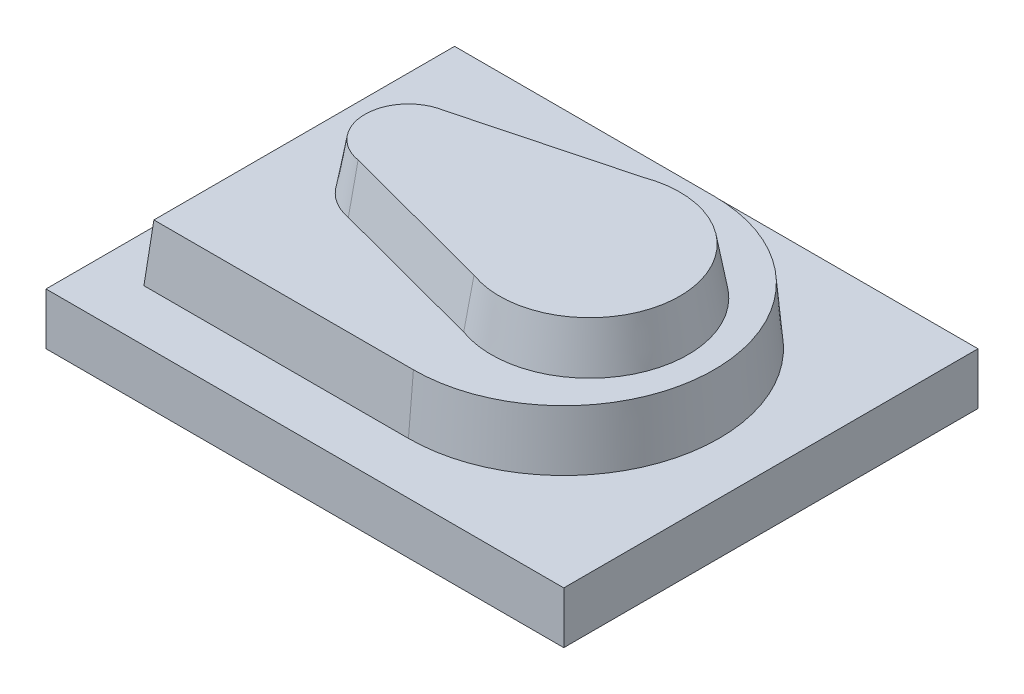
ISO-10303-21;
HEADER;
FILE_DESCRIPTION(('STEP AP214'),'2;1');
FILE_NAME('part.step','',(''),(''),'','','');
FILE_SCHEMA(('AUTOMOTIVE_DESIGN { 1 0 10303 214 1 1 1 1 }'));
ENDSEC;
DATA;
#1=APPLICATION_CONTEXT('core data for automotive mechanical design processes');
#2=APPLICATION_PROTOCOL_DEFINITION('international standard','automotive_design',2000,#1);
#3=PRODUCT_CONTEXT('',#1,'mechanical');
#4=PRODUCT('Part','Part','',(#3));
#5=PRODUCT_RELATED_PRODUCT_CATEGORY('part','',(#4));
#6=PRODUCT_DEFINITION_FORMATION('','',#4);
#7=PRODUCT_DEFINITION_CONTEXT('part definition',#1,'design');
#8=PRODUCT_DEFINITION('design','',#6,#7);
#9=PRODUCT_DEFINITION_SHAPE('','',#8);
#10=(LENGTH_UNIT() NAMED_UNIT(*) SI_UNIT(.MILLI.,.METRE.));
#11=(NAMED_UNIT(*) PLANE_ANGLE_UNIT() SI_UNIT($,.RADIAN.));
#12=(NAMED_UNIT(*) SI_UNIT($,.STERADIAN.) SOLID_ANGLE_UNIT());
#13=UNCERTAINTY_MEASURE_WITH_UNIT(LENGTH_MEASURE(1.E-05),#10,'distance_accuracy_value','');
#14=(GEOMETRIC_REPRESENTATION_CONTEXT(3) GLOBAL_UNCERTAINTY_ASSIGNED_CONTEXT((#13)) GLOBAL_UNIT_ASSIGNED_CONTEXT((#10,
#11,#12)) REPRESENTATION_CONTEXT('',''));
#15=CARTESIAN_POINT('',(0.,0.,0.));
#16=DIRECTION('',(0.,0.,1.));
#17=DIRECTION('',(1.,0.,0.));
#18=AXIS2_PLACEMENT_3D('',#15,#16,#17);
#19=CARTESIAN_POINT('',(50.,10.,-40.));
#20=DIRECTION('',(-1.,0.,0.));
#21=DIRECTION('',(0.,0.,1.));
#22=AXIS2_PLACEMENT_3D('',#19,#20,#21);
#23=PLANE('',#22);
#24=DIRECTION('',(0.,0.,-1.));
#25=VECTOR('',#24,1.);
#26=CARTESIAN_POINT('',(50.,0.,-40.));
#27=LINE('',#26,#25);
#28=CARTESIAN_POINT('',(50.,0.,40.));
#29=VERTEX_POINT('',#28);
#30=CARTESIAN_POINT('',(50.,0.,-40.));
#31=VERTEX_POINT('',#30);
#32=EDGE_CURVE('E210',#29,#31,#27,.T.);
#33=ORIENTED_EDGE('',*,*,#32,.T.);
#34=DIRECTION('',(0.,-1.,0.));
#35=VECTOR('',#34,1.);
#36=CARTESIAN_POINT('',(50.,10.,-40.));
#37=LINE('',#36,#35);
#38=CARTESIAN_POINT('',(50.,10.,-40.));
#39=VERTEX_POINT('',#38);
#40=EDGE_CURVE('E11',#39,#31,#37,.T.);
#41=ORIENTED_EDGE('',*,*,#40,.F.);
#42=DIRECTION('',(0.,0.,-1.));
#43=VECTOR('',#42,1.);
#44=CARTESIAN_POINT('',(50.,10.,-40.));
#45=LINE('',#44,#43);
#46=CARTESIAN_POINT('',(50.,10.,40.));
#47=VERTEX_POINT('',#46);
#48=EDGE_CURVE('E228',#47,#39,#45,.T.);
#49=ORIENTED_EDGE('',*,*,#48,.F.);
#50=DIRECTION('',(0.,-1.,0.));
#51=VECTOR('',#50,1.);
#52=CARTESIAN_POINT('',(50.,10.,40.));
#53=LINE('',#52,#51);
#54=EDGE_CURVE('E238',#47,#29,#53,.T.);
#55=ORIENTED_EDGE('',*,*,#54,.T.);
#56=EDGE_LOOP('',(#33,#41,#49,#55));
#57=FACE_BOUND('',#56,.T.);
#58=ADVANCED_FACE('F37',(#57),#23,.F.);
#59=CARTESIAN_POINT('',(-50.,10.,-40.));
#60=DIRECTION('',(0.,0.,1.));
#61=DIRECTION('',(1.,0.,0.));
#62=AXIS2_PLACEMENT_3D('',#59,#60,#61);
#63=PLANE('',#62);
#64=DIRECTION('',(-1.,0.,0.));
#65=VECTOR('',#64,1.);
#66=CARTESIAN_POINT('',(-50.,0.,-40.));
#67=LINE('',#66,#65);
#68=CARTESIAN_POINT('',(-50.,0.,-40.));
#69=VERTEX_POINT('',#68);
#70=EDGE_CURVE('E241',#31,#69,#67,.T.);
#71=ORIENTED_EDGE('',*,*,#70,.T.);
#72=DIRECTION('',(0.,-1.,0.));
#73=VECTOR('',#72,1.);
#74=CARTESIAN_POINT('',(-50.,10.,-40.));
#75=LINE('',#74,#73);
#76=CARTESIAN_POINT('',(-50.,10.,-40.));
#77=VERTEX_POINT('',#76);
#78=EDGE_CURVE('E44',#77,#69,#75,.T.);
#79=ORIENTED_EDGE('',*,*,#78,.F.);
#80=DIRECTION('',(-1.,0.,0.));
#81=VECTOR('',#80,1.);
#82=CARTESIAN_POINT('',(-50.,10.,-40.));
#83=LINE('',#82,#81);
#84=EDGE_CURVE('E231',#39,#77,#83,.T.);
#85=ORIENTED_EDGE('',*,*,#84,.F.);
#86=ORIENTED_EDGE('',*,*,#40,.T.);
#87=EDGE_LOOP('',(#71,#79,#85,#86));
#88=FACE_BOUND('',#87,.T.);
#89=ADVANCED_FACE('F271',(#88),#63,.F.);
#90=CARTESIAN_POINT('',(-50.,10.,-40.));
#91=DIRECTION('',(1.,0.,0.));
#92=DIRECTION('',(0.,0.,-1.));
#93=AXIS2_PLACEMENT_3D('',#90,#91,#92);
#94=PLANE('',#93);
#95=DIRECTION('',(0.,0.,1.));
#96=VECTOR('',#95,1.);
#97=CARTESIAN_POINT('',(-50.,0.,-40.));
#98=LINE('',#97,#96);
#99=CARTESIAN_POINT('',(-50.,0.,40.));
#100=VERTEX_POINT('',#99);
#101=EDGE_CURVE('E243',#69,#100,#98,.T.);
#102=ORIENTED_EDGE('',*,*,#101,.T.);
#103=DIRECTION('',(0.,-1.,0.));
#104=VECTOR('',#103,1.);
#105=CARTESIAN_POINT('',(-50.,10.,40.));
#106=LINE('',#105,#104);
#107=CARTESIAN_POINT('',(-50.,10.,40.));
#108=VERTEX_POINT('',#107);
#109=EDGE_CURVE('E248',#108,#100,#106,.T.);
#110=ORIENTED_EDGE('',*,*,#109,.F.);
#111=DIRECTION('',(0.,0.,1.));
#112=VECTOR('',#111,1.);
#113=CARTESIAN_POINT('',(-50.,10.,-40.));
#114=LINE('',#113,#112);
#115=EDGE_CURVE('E234',#77,#108,#114,.T.);
#116=ORIENTED_EDGE('',*,*,#115,.F.);
#117=ORIENTED_EDGE('',*,*,#78,.T.);
#118=EDGE_LOOP('',(#102,#110,#116,#117));
#119=FACE_BOUND('',#118,.T.);
#120=ADVANCED_FACE('F255',(#119),#94,.F.);
#121=CARTESIAN_POINT('',(-50.,10.,40.));
#122=DIRECTION('',(0.,0.,-1.));
#123=DIRECTION('',(-1.,0.,0.));
#124=AXIS2_PLACEMENT_3D('',#121,#122,#123);
#125=PLANE('',#124);
#126=DIRECTION('',(1.,0.,0.));
#127=VECTOR('',#126,1.);
#128=CARTESIAN_POINT('',(-50.,0.,40.));
#129=LINE('',#128,#127);
#130=EDGE_CURVE('E232',#100,#29,#129,.T.);
#131=ORIENTED_EDGE('',*,*,#130,.T.);
#132=ORIENTED_EDGE('',*,*,#54,.F.);
#133=DIRECTION('',(1.,0.,0.));
#134=VECTOR('',#133,1.);
#135=CARTESIAN_POINT('',(-50.,10.,40.));
#136=LINE('',#135,#134);
#137=EDGE_CURVE('E236',#108,#47,#136,.T.);
#138=ORIENTED_EDGE('',*,*,#137,.F.);
#139=ORIENTED_EDGE('',*,*,#109,.T.);
#140=EDGE_LOOP('',(#131,#132,#138,#139));
#141=FACE_BOUND('',#140,.T.);
#142=ADVANCED_FACE('F264',(#141),#125,.F.);
#143=CARTESIAN_POINT('',(0.,10.,0.));
#144=DIRECTION('',(0.,1.,0.));
#145=DIRECTION('',(0.,0.,1.));
#146=AXIS2_PLACEMENT_3D('',#143,#144,#145);
#147=PLANE('',#146);
#148=CARTESIAN_POINT('',(10.,10.,0.));
#149=DIRECTION('',(0.,1.,0.));
#150=DIRECTION('',(0.,0.,-1.));
#151=AXIS2_PLACEMENT_3D('',#148,#149,#150);
#152=CIRCLE('',#151,30.);
#153=CARTESIAN_POINT('',(10.,10.,30.));
#154=VERTEX_POINT('',#153);
#155=CARTESIAN_POINT('',(10.,10.,-30.));
#156=VERTEX_POINT('',#155);
#157=EDGE_CURVE('E157',#154,#156,#152,.T.);
#158=ORIENTED_EDGE('',*,*,#157,.F.);
#159=DIRECTION('',(1.,0.,0.));
#160=VECTOR('',#159,1.);
#161=CARTESIAN_POINT('',(-41.0897911259424,10.,30.));
#162=LINE('',#161,#160);
#163=CARTESIAN_POINT('',(-41.0897911259424,10.,30.));
#164=VERTEX_POINT('',#163);
#165=EDGE_CURVE('E203',#164,#154,#162,.T.);
#166=ORIENTED_EDGE('',*,*,#165,.F.);
#167=DIRECTION('',(0.,0.,1.));
#168=VECTOR('',#167,1.);
#169=CARTESIAN_POINT('',(-41.0897911259424,10.,-30.));
#170=LINE('',#169,#168);
#171=CARTESIAN_POINT('',(-41.0897911259424,10.,-30.));
#172=VERTEX_POINT('',#171);
#173=EDGE_CURVE('E200',#172,#164,#170,.T.);
#174=ORIENTED_EDGE('',*,*,#173,.F.);
#175=DIRECTION('',(-1.,0.,0.));
#176=VECTOR('',#175,1.);
#177=CARTESIAN_POINT('',(10.,10.,-30.));
#178=LINE('',#177,#176);
#179=EDGE_CURVE('E197',#156,#172,#178,.T.);
#180=ORIENTED_EDGE('',*,*,#179,.F.);
#181=EDGE_LOOP('',(#158,#166,#174,#180));
#182=FACE_BOUND('',#181,.T.);
#183=ORIENTED_EDGE('',*,*,#48,.T.);
#184=ORIENTED_EDGE('',*,*,#84,.T.);
#185=ORIENTED_EDGE('',*,*,#115,.T.);
#186=ORIENTED_EDGE('',*,*,#137,.T.);
#187=EDGE_LOOP('',(#183,#184,#185,#186));
#188=FACE_BOUND('',#187,.T.);
#189=ADVANCED_FACE('F270',(#182,#188),#147,.T.);
#190=CARTESIAN_POINT('',(0.,0.,0.));
#191=DIRECTION('',(0.,1.,0.));
#192=DIRECTION('',(0.,0.,1.));
#193=AXIS2_PLACEMENT_3D('',#190,#191,#192);
#194=PLANE('',#193);
#195=ORIENTED_EDGE('',*,*,#32,.F.);
#196=ORIENTED_EDGE('',*,*,#130,.F.);
#197=ORIENTED_EDGE('',*,*,#101,.F.);
#198=ORIENTED_EDGE('',*,*,#70,.F.);
#199=EDGE_LOOP('',(#195,#196,#197,#198));
#200=FACE_BOUND('',#199,.T.);
#201=ADVANCED_FACE('F261',(#200),#194,.F.);
#202=CARTESIAN_POINT('',(10.,10.,0.));
#203=DIRECTION('',(0.,-1.,0.));
#204=DIRECTION('',(0.,0.,-1.));
#205=AXIS2_PLACEMENT_3D('',#202,#203,#204);
#206=CONICAL_SURFACE('',#205,30.,0.0872664625997167);
#207=ORIENTED_EDGE('',*,*,#157,.T.);
#208=DIRECTION('',(0.,-0.996194698091745,-0.0871557427476584));
#209=VECTOR('',#208,1.);
#210=CARTESIAN_POINT('',(10.,10.,-30.));
#211=LINE('',#210,#209);
#212=CARTESIAN_POINT('',(10.,21.,-29.0376247012148));
#213=VERTEX_POINT('',#212);
#214=EDGE_CURVE('E207',#213,#156,#211,.T.);
#215=ORIENTED_EDGE('',*,*,#214,.F.);
#216=CARTESIAN_POINT('',(10.,21.,0.));
#217=DIRECTION('',(0.,-1.,0.));
#218=DIRECTION('',(0.,0.,-1.));
#219=AXIS2_PLACEMENT_3D('',#216,#217,#218);
#220=CIRCLE('',#219,29.0376247012148);
#221=CARTESIAN_POINT('',(10.,21.,29.0376247012148));
#222=VERTEX_POINT('',#221);
#223=EDGE_CURVE('E206',#222,#213,#220,.F.);
#224=ORIENTED_EDGE('',*,*,#223,.F.);
#225=DIRECTION('',(0.,-0.996194698091745,0.0871557427476583));
#226=VECTOR('',#225,1.);
#227=CARTESIAN_POINT('',(10.,10.,30.));
#228=LINE('',#227,#226);
#229=EDGE_CURVE('E212',#222,#154,#228,.T.);
#230=ORIENTED_EDGE('',*,*,#229,.T.);
#231=EDGE_LOOP('',(#207,#215,#224,#230));
#232=FACE_BOUND('',#231,.T.);
#233=ADVANCED_FACE('F283',(#232),#206,.T.);
#234=CARTESIAN_POINT('',(10.,10.,-30.));
#235=DIRECTION('',(0.,0.0871557427476584,-0.996194698091746));
#236=DIRECTION('',(0.,0.996194698091746,0.0871557427476584));
#237=AXIS2_PLACEMENT_3D('',#234,#235,#236);
#238=PLANE('',#237);
#239=ORIENTED_EDGE('',*,*,#179,.T.);
#240=DIRECTION('',(-0.0868265938642478,-0.992432509138967,-0.0868265938642478));
#241=VECTOR('',#240,1.);
#242=CARTESIAN_POINT('',(-41.0897911259424,10.,-30.));
#243=LINE('',#242,#241);
#244=CARTESIAN_POINT('',(-40.1274158271572,21.,-29.0376247012148));
#245=VERTEX_POINT('',#244);
#246=EDGE_CURVE('E211',#245,#172,#243,.T.);
#247=ORIENTED_EDGE('',*,*,#246,.F.);
#248=DIRECTION('',(1.,0.,0.));
#249=VECTOR('',#248,1.);
#250=CARTESIAN_POINT('',(10.,21.,-29.0376247012148));
#251=LINE('',#250,#249);
#252=EDGE_CURVE('E223',#213,#245,#251,.F.);
#253=ORIENTED_EDGE('',*,*,#252,.F.);
#254=ORIENTED_EDGE('',*,*,#214,.T.);
#255=EDGE_LOOP('',(#239,#247,#253,#254));
#256=FACE_BOUND('',#255,.T.);
#257=ADVANCED_FACE('F287',(#256),#238,.T.);
#258=CARTESIAN_POINT('',(-41.0897911259424,10.,-30.));
#259=DIRECTION('',(-0.996194698091746,0.0871557427476584,0.));
#260=DIRECTION('',(-0.0871557427476584,-0.996194698091746,0.));
#261=AXIS2_PLACEMENT_3D('',#258,#259,#260);
#262=PLANE('',#261);
#263=ORIENTED_EDGE('',*,*,#173,.T.);
#264=DIRECTION('',(-0.0868265938642478,-0.992432509138967,0.0868265938642478));
#265=VECTOR('',#264,1.);
#266=CARTESIAN_POINT('',(-41.0897911259424,10.,30.));
#267=LINE('',#266,#265);
#268=CARTESIAN_POINT('',(-40.1274158271572,21.,29.0376247012148));
#269=VERTEX_POINT('',#268);
#270=EDGE_CURVE('E215',#269,#164,#267,.T.);
#271=ORIENTED_EDGE('',*,*,#270,.F.);
#272=DIRECTION('',(0.,0.,-1.));
#273=VECTOR('',#272,1.);
#274=CARTESIAN_POINT('',(-40.1274158271572,21.,0.));
#275=LINE('',#274,#273);
#276=EDGE_CURVE('E225',#245,#269,#275,.F.);
#277=ORIENTED_EDGE('',*,*,#276,.F.);
#278=ORIENTED_EDGE('',*,*,#246,.T.);
#279=EDGE_LOOP('',(#263,#271,#277,#278));
#280=FACE_BOUND('',#279,.T.);
#281=ADVANCED_FACE('F290',(#280),#262,.T.);
#282=CARTESIAN_POINT('',(-41.0897911259424,10.,30.));
#283=DIRECTION('',(0.,0.0871557427476584,0.996194698091745));
#284=DIRECTION('',(0.,-0.996194698091746,0.0871557427476584));
#285=AXIS2_PLACEMENT_3D('',#282,#283,#284);
#286=PLANE('',#285);
#287=ORIENTED_EDGE('',*,*,#165,.T.);
#288=ORIENTED_EDGE('',*,*,#229,.F.);
#289=DIRECTION('',(-1.,0.,0.));
#290=VECTOR('',#289,1.);
#291=CARTESIAN_POINT('',(10.,21.,29.0376247012148));
#292=LINE('',#291,#290);
#293=EDGE_CURVE('E216',#269,#222,#292,.F.);
#294=ORIENTED_EDGE('',*,*,#293,.F.);
#295=ORIENTED_EDGE('',*,*,#270,.T.);
#296=EDGE_LOOP('',(#287,#288,#294,#295));
#297=FACE_BOUND('',#296,.T.);
#298=ADVANCED_FACE('F294',(#297),#286,.T.);
#299=CARTESIAN_POINT('',(10.,21.,0.));
#300=DIRECTION('',(0.,-1.,0.));
#301=DIRECTION('',(0.,0.,-1.));
#302=AXIS2_PLACEMENT_3D('',#299,#300,#301);
#303=PLANE('',#302);
#304=DIRECTION('',(0.966679512896648,0.,0.255989686014689));
#305=VECTOR('',#304,1.);
#306=CARTESIAN_POINT('',(-21.7670121436894,21.,9.84264538038703));
#307=LINE('',#306,#305);
#308=CARTESIAN_POINT('',(-21.7670121436894,21.,9.84264538038703));
#309=VERTEX_POINT('',#308);
#310=CARTESIAN_POINT('',(8.54274170911381,21.,17.8690742727423));
#311=VERTEX_POINT('',#310);
#312=EDGE_CURVE('E127',#309,#311,#307,.T.);
#313=ORIENTED_EDGE('',*,*,#312,.F.);
#314=CARTESIAN_POINT('',(-20.,21.,0.));
#315=DIRECTION('',(0.,-1.,0.));
#316=DIRECTION('',(0.,0.,-1.));
#317=AXIS2_PLACEMENT_3D('',#314,#315,#316);
#318=CIRCLE('',#317,10.);
#319=CARTESIAN_POINT('',(-21.7647349909528,21.,-9.84305391693588));
#320=VERTEX_POINT('',#319);
#321=EDGE_CURVE('E51',#309,#320,#318,.T.);
#322=ORIENTED_EDGE('',*,*,#321,.T.);
#323=DIRECTION('',(0.966695617723164,0.,-0.255928862527911));
#324=VECTOR('',#323,1.);
#325=CARTESIAN_POINT('',(-21.7647349909528,21.,-9.84305391693588));
#326=LINE('',#325,#324);
#327=CARTESIAN_POINT('',(8.51978118974144,21.,-17.860760458927));
#328=VERTEX_POINT('',#327);
#329=EDGE_CURVE('E56',#320,#328,#326,.T.);
#330=ORIENTED_EDGE('',*,*,#329,.T.);
#331=CARTESIAN_POINT('',(15.,21.,0.));
#332=DIRECTION('',(0.,-1.,0.));
#333=DIRECTION('',(0.,0.,-1.));
#334=AXIS2_PLACEMENT_3D('',#331,#332,#333);
#335=CIRCLE('',#334,19.);
#336=EDGE_CURVE('E122',#328,#311,#335,.T.);
#337=ORIENTED_EDGE('',*,*,#336,.T.);
#338=EDGE_LOOP('',(#313,#322,#330,#337));
#339=FACE_BOUND('',#338,.T.);
#340=ORIENTED_EDGE('',*,*,#223,.T.);
#341=ORIENTED_EDGE('',*,*,#252,.T.);
#342=ORIENTED_EDGE('',*,*,#276,.T.);
#343=ORIENTED_EDGE('',*,*,#293,.T.);
#344=EDGE_LOOP('',(#340,#341,#342,#343));
#345=FACE_BOUND('',#344,.T.);
#346=ADVANCED_FACE('F124',(#339,#345),#303,.F.);
#347=CARTESIAN_POINT('',(-20.,21.,0.));
#348=DIRECTION('',(0.,-1.,0.));
#349=DIRECTION('',(0.,0.,-1.));
#350=AXIS2_PLACEMENT_3D('',#347,#348,#349);
#351=CONICAL_SURFACE('',#350,10.,0.174532925199433);
#352=ORIENTED_EDGE('',*,*,#321,.F.);
#353=CARTESIAN_POINT('',(-21.4258137358321,30.,8.29135611328905));
#354=CARTESIAN_POINT('',(-21.4822113641602,28.5000035115907,8.55002782130688));
#355=CARTESIAN_POINT('',(-21.5388433790417,27.000005265748,8.8086377811895));
#356=CARTESIAN_POINT('',(-21.6525761816628,24.000005265748,9.32573420355496));
#357=CARTESIAN_POINT('',(-21.7096769694005,22.5000035115907,9.58422066603833));
#358=CARTESIAN_POINT('',(-21.7670121436894,21.,9.84264538038703));
#359=B_SPLINE_CURVE_WITH_KNOTS('',3,(#353,#354,#355,#356,#357,#358),.UNSPECIFIED.,.F.,.F.,(4,2,
4),(0.,4.56954366495401,9.13908730994758),.UNSPECIFIED.);
#360=CARTESIAN_POINT('',(-21.4258137358321,30.,8.29135611328905));
#361=VERTEX_POINT('',#360);
#362=EDGE_CURVE('E139',#361,#309,#359,.T.);
#363=ORIENTED_EDGE('',*,*,#362,.F.);
#364=CARTESIAN_POINT('',(-20.,30.,0.));
#365=DIRECTION('',(0.,-1.,0.));
#366=DIRECTION('',(0.,0.,-1.));
#367=AXIS2_PLACEMENT_3D('',#364,#365,#366);
#368=CIRCLE('',#367,8.41305717362381);
#369=CARTESIAN_POINT('',(-21.4237692157334,30.,-8.29170743737338));
#370=VERTEX_POINT('',#369);
#371=EDGE_CURVE('E143',#361,#370,#368,.T.);
#372=ORIENTED_EDGE('',*,*,#371,.T.);
#373=CARTESIAN_POINT('',(-21.4237692157334,30.,-8.29170743737338));
#374=CARTESIAN_POINT('',(-21.4801270873024,28.5000035262109,-8.55038890726603));
#375=CARTESIAN_POINT('',(-21.5367198377515,27.0000052876715,-8.80900851579262));
#376=CARTESIAN_POINT('',(-21.65037509616,24.0000052876714,-9.32612400897957));
#377=CARTESIAN_POINT('',(-21.7074376041175,22.5000035262109,-9.58461989364048));
#378=CARTESIAN_POINT('',(-21.7647349909528,21.,-9.84305391693588));
#379=B_SPLINE_CURVE_WITH_KNOTS('',3,(#373,#374,#375,#376,#377,#378),.UNSPECIFIED.,.F.,.F.,(4,2,
4),(0.,4.56954417994325,9.13908833984282),.UNSPECIFIED.);
#380=EDGE_CURVE('E158',#370,#320,#379,.T.);
#381=ORIENTED_EDGE('',*,*,#380,.T.);
#382=EDGE_LOOP('',(#352,#363,#372,#381));
#383=FACE_BOUND('',#382,.T.);
#384=ADVANCED_FACE('F167',(#383),#351,.T.);
#385=CARTESIAN_POINT('',(-21.7670121436894,21.,9.84264538038703));
#386=DIRECTION('',(-0.252100627478426,0.173648177666931,0.951993478978684));
#387=DIRECTION('',(0.966679512896648,0.,0.255989686014689));
#388=AXIS2_PLACEMENT_3D('',#385,#386,#387);
#389=PLANE('',#388);
#390=ORIENTED_EDGE('',*,*,#312,.T.);
#391=CARTESIAN_POINT('',(9.017915907122,30.,16.3532635898046));
#392=CARTESIAN_POINT('',(8.93846936554329,28.5000019942351,16.6058319135709));
#393=CARTESIAN_POINT('',(8.85914824490741,27.0000029911153,16.8584336324055));
#394=CARTESIAN_POINT('',(8.70075684557144,24.0000029911153,17.3637038600515));
#395=CARTESIAN_POINT('',(8.62168656687118,22.5000019942352,17.6163723688627));
#396=CARTESIAN_POINT('',(8.5427417091136,21.,17.8690742727423));
#397=B_SPLINE_CURVE_WITH_KNOTS('',3,(#391,#392,#393,#394,#395,#396),.UNSPECIFIED.,.F.,.F.,(4,2,
4),(0.,4.56955887379493,9.13911774469723),.UNSPECIFIED.);
#398=CARTESIAN_POINT('',(9.017915907122,30.,16.3532635898046));
#399=VERTEX_POINT('',#398);
#400=EDGE_CURVE('E133',#399,#311,#397,.T.);
#401=ORIENTED_EDGE('',*,*,#400,.F.);
#402=DIRECTION('',(-0.966679512896648,0.,-0.255989686014689));
#403=VECTOR('',#402,1.);
#404=CARTESIAN_POINT('',(-22.1452134590476,30.,8.10084942849011));
#405=LINE('',#404,#403);
#406=EDGE_CURVE('E190',#361,#399,#405,.F.);
#407=ORIENTED_EDGE('',*,*,#406,.F.);
#408=ORIENTED_EDGE('',*,*,#362,.T.);
#409=EDGE_LOOP('',(#390,#401,#407,#408));
#410=FACE_BOUND('',#409,.T.);
#411=ADVANCED_FACE('F142',(#410),#389,.T.);
#412=CARTESIAN_POINT('',(15.,21.,0.));
#413=DIRECTION('',(0.,-1.,0.));
#414=DIRECTION('',(0.,0.,-1.));
#415=AXIS2_PLACEMENT_3D('',#412,#413,#414);
#416=CONICAL_SURFACE('',#415,19.,0.174532925199433);
#417=ORIENTED_EDGE('',*,*,#336,.F.);
#418=CARTESIAN_POINT('',(8.9959188623211,30.,-16.3452002075246));
#419=CARTESIAN_POINT('',(8.91630787037536,28.500002056094,-16.5977257734099));
#420=CARTESIAN_POINT('',(8.83682423500793,27.0000030838962,-16.8502852440107));
#421=CARTESIAN_POINT('',(8.67811167748148,24.0000030838962,-17.3554719944782));
#422=CARTESIAN_POINT('',(8.5988827553223,22.500002056094,-17.6080992743449));
#423=CARTESIAN_POINT('',(8.51978118974125,21.,-17.860760458927));
#424=B_SPLINE_CURVE_WITH_KNOTS('',3,(#418,#419,#420,#421,#422,#423),.UNSPECIFIED.,.F.,.F.,(4,2,
4),(0.,4.56956318040156,9.13912635782058),.UNSPECIFIED.);
#425=CARTESIAN_POINT('',(8.9959188623211,30.,-16.3452002075246));
#426=VERTEX_POINT('',#425);
#427=EDGE_CURVE('E140',#426,#328,#424,.T.);
#428=ORIENTED_EDGE('',*,*,#427,.F.);
#429=CARTESIAN_POINT('',(15.,30.,0.));
#430=DIRECTION('',(0.,-1.,0.));
#431=DIRECTION('',(0.,0.,-1.));
#432=AXIS2_PLACEMENT_3D('',#429,#430,#431);
#433=CIRCLE('',#432,17.4130571736238);
#434=EDGE_CURVE('E136',#426,#399,#433,.T.);
#435=ORIENTED_EDGE('',*,*,#434,.T.);
#436=ORIENTED_EDGE('',*,*,#400,.T.);
#437=EDGE_LOOP('',(#417,#428,#435,#436));
#438=FACE_BOUND('',#437,.T.);
#439=ADVANCED_FACE('F134',(#438),#416,.T.);
#440=CARTESIAN_POINT('',(-21.7647349909528,21.,-9.84305391693588));
#441=DIRECTION('',(-0.252040728037082,0.173648177666931,-0.952009339136698));
#442=DIRECTION('',(-0.966695617723164,0.,0.255928862527911));
#443=AXIS2_PLACEMENT_3D('',#440,#441,#442);
#444=PLANE('',#443);
#445=ORIENTED_EDGE('',*,*,#329,.F.);
#446=ORIENTED_EDGE('',*,*,#380,.F.);
#447=DIRECTION('',(0.966695617723164,0.,-0.255928862527911));
#448=VECTOR('',#447,1.);
#449=CARTESIAN_POINT('',(-22.1446687372229,30.,-8.10085212454361));
#450=LINE('',#449,#448);
#451=EDGE_CURVE('E146',#370,#426,#450,.T.);
#452=ORIENTED_EDGE('',*,*,#451,.T.);
#453=ORIENTED_EDGE('',*,*,#427,.T.);
#454=EDGE_LOOP('',(#445,#446,#452,#453));
#455=FACE_BOUND('',#454,.T.);
#456=ADVANCED_FACE('F171',(#455),#444,.T.);
#457=CARTESIAN_POINT('',(-20.,30.,0.));
#458=DIRECTION('',(0.,-1.,0.));
#459=DIRECTION('',(0.,0.,-1.));
#460=AXIS2_PLACEMENT_3D('',#457,#458,#459);
#461=PLANE('',#460);
#462=ORIENTED_EDGE('',*,*,#371,.F.);
#463=ORIENTED_EDGE('',*,*,#406,.T.);
#464=ORIENTED_EDGE('',*,*,#434,.F.);
#465=ORIENTED_EDGE('',*,*,#451,.F.);
#466=EDGE_LOOP('',(#462,#463,#464,#465));
#467=FACE_BOUND('',#466,.T.);
#468=ADVANCED_FACE('F176',(#467),#461,.F.);
#469=CLOSED_SHELL('',(#58,#89,#120,#142,#189,#201,#233,#257,#281,#298,#346,#384,#411,#439,#456,#468));
#470=MANIFOLD_SOLID_BREP('B2',#469);
#471=ADVANCED_BREP_SHAPE_REPRESENTATION('',(#18,#470),#14);
#472=SHAPE_DEFINITION_REPRESENTATION(#9,#471);
ENDSEC;
END-ISO-10303-21;
